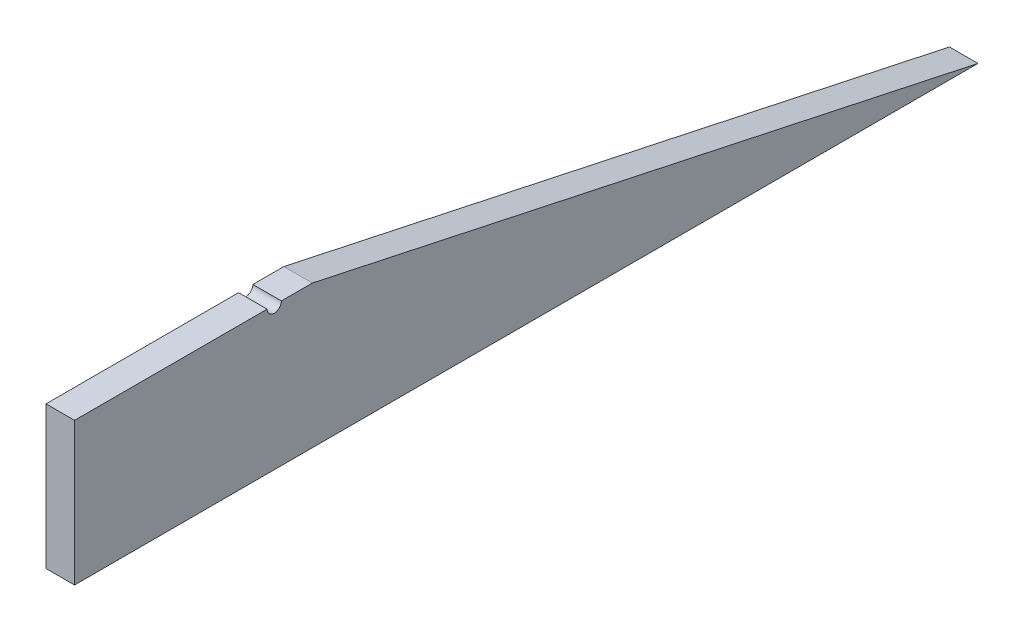
ISO-10303-21;
HEADER;
FILE_DESCRIPTION(('STEP AP214'),'2;1');
FILE_NAME('part.step','',(''),(''),'','','');
FILE_SCHEMA(('AUTOMOTIVE_DESIGN { 1 0 10303 214 1 1 1 1 }'));
ENDSEC;
DATA;
#1=APPLICATION_CONTEXT('core data for automotive mechanical design processes');
#2=APPLICATION_PROTOCOL_DEFINITION('international standard','automotive_design',2000,#1);
#3=PRODUCT_CONTEXT('',#1,'mechanical');
#4=PRODUCT('Part','Part','',(#3));
#5=PRODUCT_RELATED_PRODUCT_CATEGORY('part','',(#4));
#6=PRODUCT_DEFINITION_FORMATION('','',#4);
#7=PRODUCT_DEFINITION_CONTEXT('part definition',#1,'design');
#8=PRODUCT_DEFINITION('design','',#6,#7);
#9=PRODUCT_DEFINITION_SHAPE('','',#8);
#10=(LENGTH_UNIT() NAMED_UNIT(*) SI_UNIT(.MILLI.,.METRE.));
#11=(NAMED_UNIT(*) PLANE_ANGLE_UNIT() SI_UNIT($,.RADIAN.));
#12=(NAMED_UNIT(*) SI_UNIT($,.STERADIAN.) SOLID_ANGLE_UNIT());
#13=UNCERTAINTY_MEASURE_WITH_UNIT(LENGTH_MEASURE(1.E-05),#10,'distance_accuracy_value','');
#14=(GEOMETRIC_REPRESENTATION_CONTEXT(3) GLOBAL_UNCERTAINTY_ASSIGNED_CONTEXT((#13)) GLOBAL_UNIT_ASSIGNED_CONTEXT((#10,
#11,#12)) REPRESENTATION_CONTEXT('',''));
#15=CARTESIAN_POINT('',(0.,0.,0.));
#16=DIRECTION('',(0.,0.,1.));
#17=DIRECTION('',(1.,0.,0.));
#18=AXIS2_PLACEMENT_3D('',#15,#16,#17);
#19=CARTESIAN_POINT('',(-0.01,-0.00209529088739757,-800.009778024141));
#20=DIRECTION('',(0.,0.97780241407741,-0.209529088730873));
#21=DIRECTION('',(0.,0.209529088730873,0.97780241407741));
#22=AXIS2_PLACEMENT_3D('',#19,#20,#21);
#23=PLANE('',#22);
#24=DIRECTION('',(0.,0.209529088730874,0.97780241407741));
#25=VECTOR('',#24,1.);
#26=CARTESIAN_POINT('',(30.,0.,-800.));
#27=LINE('',#26,#25);
#28=CARTESIAN_POINT('',(30.,0.,-800.));
#29=VERTEX_POINT('',#28);
#30=CARTESIAN_POINT('',(30.,150.,-99.9999999999995));
#31=VERTEX_POINT('',#30);
#32=EDGE_CURVE('E21',#29,#31,#27,.T.);
#33=ORIENTED_EDGE('',*,*,#32,.F.);
#34=DIRECTION('',(1.,0.,0.));
#35=VECTOR('',#34,1.);
#36=CARTESIAN_POINT('',(15.,0.,-800.));
#37=LINE('',#36,#35);
#38=CARTESIAN_POINT('',(0.,0.,-800.000000000001));
#39=VERTEX_POINT('',#38);
#40=EDGE_CURVE('E61',#39,#29,#37,.T.);
#41=ORIENTED_EDGE('',*,*,#40,.F.);
#42=DIRECTION('',(0.,-0.209529088730874,-0.97780241407741));
#43=VECTOR('',#42,1.);
#44=CARTESIAN_POINT('',(0.,150.,-100.));
#45=LINE('',#44,#43);
#46=CARTESIAN_POINT('',(0.,150.,-100.));
#47=VERTEX_POINT('',#46);
#48=EDGE_CURVE('E110',#47,#39,#45,.T.);
#49=ORIENTED_EDGE('',*,*,#48,.F.);
#50=DIRECTION('',(-1.,0.,0.));
#51=VECTOR('',#50,1.);
#52=CARTESIAN_POINT('',(15.,150.,-100.));
#53=LINE('',#52,#51);
#54=EDGE_CURVE('E114',#31,#47,#53,.T.);
#55=ORIENTED_EDGE('',*,*,#54,.F.);
#56=EDGE_LOOP('',(#33,#41,#49,#55));
#57=FACE_BOUND('',#56,.T.);
#58=ADVANCED_FACE('F17',(#57),#23,.T.);
#59=CARTESIAN_POINT('',(-0.01,0.,150.01));
#60=DIRECTION('',(0.,-1.,0.));
#61=DIRECTION('',(0.,0.,-1.));
#62=AXIS2_PLACEMENT_3D('',#59,#60,#61);
#63=PLANE('',#62);
#64=DIRECTION('',(0.,0.,-1.));
#65=VECTOR('',#64,1.);
#66=CARTESIAN_POINT('',(30.,0.,-325.));
#67=LINE('',#66,#65);
#68=CARTESIAN_POINT('',(30.,0.,150.));
#69=VERTEX_POINT('',#68);
#70=EDGE_CURVE('E85',#69,#29,#67,.T.);
#71=ORIENTED_EDGE('',*,*,#70,.F.);
#72=DIRECTION('',(1.,0.,0.));
#73=VECTOR('',#72,1.);
#74=CARTESIAN_POINT('',(15.,0.,150.));
#75=LINE('',#74,#73);
#76=CARTESIAN_POINT('',(0.,0.,150.));
#77=VERTEX_POINT('',#76);
#78=EDGE_CURVE('E70',#77,#69,#75,.T.);
#79=ORIENTED_EDGE('',*,*,#78,.F.);
#80=DIRECTION('',(0.,0.,1.));
#81=VECTOR('',#80,1.);
#82=CARTESIAN_POINT('',(0.,0.,-325.));
#83=LINE('',#82,#81);
#84=EDGE_CURVE('E103',#39,#77,#83,.T.);
#85=ORIENTED_EDGE('',*,*,#84,.F.);
#86=ORIENTED_EDGE('',*,*,#40,.T.);
#87=EDGE_LOOP('',(#71,#79,#85,#86));
#88=FACE_BOUND('',#87,.T.);
#89=ADVANCED_FACE('F159',(#88),#63,.T.);
#90=CARTESIAN_POINT('',(-0.01,150.01,150.));
#91=DIRECTION('',(0.,0.,1.));
#92=DIRECTION('',(0.,-1.,0.));
#93=AXIS2_PLACEMENT_3D('',#90,#91,#92);
#94=PLANE('',#93);
#95=DIRECTION('',(0.,-1.,0.));
#96=VECTOR('',#95,1.);
#97=CARTESIAN_POINT('',(30.,75.,150.));
#98=LINE('',#97,#96);
#99=CARTESIAN_POINT('',(30.,150.,150.));
#100=VERTEX_POINT('',#99);
#101=EDGE_CURVE('E78',#100,#69,#98,.T.);
#102=ORIENTED_EDGE('',*,*,#101,.F.);
#103=DIRECTION('',(1.,0.,0.));
#104=VECTOR('',#103,1.);
#105=CARTESIAN_POINT('',(15.,150.,150.));
#106=LINE('',#105,#104);
#107=CARTESIAN_POINT('',(0.,150.,150.));
#108=VERTEX_POINT('',#107);
#109=EDGE_CURVE('E82',#108,#100,#106,.T.);
#110=ORIENTED_EDGE('',*,*,#109,.F.);
#111=DIRECTION('',(0.,1.,0.));
#112=VECTOR('',#111,1.);
#113=CARTESIAN_POINT('',(0.,75.,150.));
#114=LINE('',#113,#112);
#115=EDGE_CURVE('E75',#77,#108,#114,.T.);
#116=ORIENTED_EDGE('',*,*,#115,.F.);
#117=ORIENTED_EDGE('',*,*,#78,.T.);
#118=EDGE_LOOP('',(#102,#110,#116,#117));
#119=FACE_BOUND('',#118,.T.);
#120=ADVANCED_FACE('F80',(#119),#94,.T.);
#121=CARTESIAN_POINT('',(30.,-0.0100000000000922,150.01));
#122=DIRECTION('',(1.,0.,0.));
#123=DIRECTION('',(0.,0.,-1.));
#124=AXIS2_PLACEMENT_3D('',#121,#122,#123);
#125=PLANE('',#124);
#126=ORIENTED_EDGE('',*,*,#32,.T.);
#127=DIRECTION('',(0.,0.,-1.));
#128=VECTOR('',#127,1.);
#129=CARTESIAN_POINT('',(30.,150.,-83.75));
#130=LINE('',#129,#128);
#131=CARTESIAN_POINT('',(30.,150.,-67.5));
#132=VERTEX_POINT('',#131);
#133=EDGE_CURVE('E117',#132,#31,#130,.T.);
#134=ORIENTED_EDGE('',*,*,#133,.F.);
#135=CARTESIAN_POINT('',(30.,150.,-60.));
#136=DIRECTION('',(-1.,0.,0.));
#137=DIRECTION('',(0.,0.,1.));
#138=AXIS2_PLACEMENT_3D('',#135,#136,#137);
#139=CIRCLE('',#138,7.5);
#140=CARTESIAN_POINT('',(30.,150.,-52.5));
#141=VERTEX_POINT('',#140);
#142=EDGE_CURVE('E91',#141,#132,#139,.F.);
#143=ORIENTED_EDGE('',*,*,#142,.F.);
#144=DIRECTION('',(0.,0.,-1.));
#145=VECTOR('',#144,1.);
#146=CARTESIAN_POINT('',(30.,150.,48.75));
#147=LINE('',#146,#145);
#148=EDGE_CURVE('E88',#100,#141,#147,.T.);
#149=ORIENTED_EDGE('',*,*,#148,.F.);
#150=ORIENTED_EDGE('',*,*,#101,.T.);
#151=ORIENTED_EDGE('',*,*,#70,.T.);
#152=EDGE_LOOP('',(#126,#134,#143,#149,#150,#151));
#153=FACE_BOUND('',#152,.T.);
#154=ADVANCED_FACE('F89',(#153),#125,.T.);
#155=CARTESIAN_POINT('',(-0.01,150.,-100.01));
#156=DIRECTION('',(0.,1.,0.));
#157=DIRECTION('',(0.,0.,1.));
#158=AXIS2_PLACEMENT_3D('',#155,#156,#157);
#159=PLANE('',#158);
#160=ORIENTED_EDGE('',*,*,#54,.T.);
#161=DIRECTION('',(0.,0.,-1.));
#162=VECTOR('',#161,1.);
#163=CARTESIAN_POINT('',(0.,150.,-325.));
#164=LINE('',#163,#162);
#165=CARTESIAN_POINT('',(0.,150.,-67.5));
#166=VERTEX_POINT('',#165);
#167=EDGE_CURVE('E116',#166,#47,#164,.T.);
#168=ORIENTED_EDGE('',*,*,#167,.F.);
#169=DIRECTION('',(-1.,0.,0.));
#170=VECTOR('',#169,1.);
#171=CARTESIAN_POINT('',(15.,150.,-67.5));
#172=LINE('',#171,#170);
#173=EDGE_CURVE('E123',#132,#166,#172,.T.);
#174=ORIENTED_EDGE('',*,*,#173,.F.);
#175=ORIENTED_EDGE('',*,*,#133,.T.);
#176=EDGE_LOOP('',(#160,#168,#174,#175));
#177=FACE_BOUND('',#176,.T.);
#178=ADVANCED_FACE('F140',(#177),#159,.T.);
#179=CARTESIAN_POINT('',(0.,-0.0100000000000922,-800.01));
#180=DIRECTION('',(-1.,0.,0.));
#181=DIRECTION('',(0.,0.,1.));
#182=AXIS2_PLACEMENT_3D('',#179,#180,#181);
#183=PLANE('',#182);
#184=ORIENTED_EDGE('',*,*,#115,.T.);
#185=DIRECTION('',(0.,0.,1.));
#186=VECTOR('',#185,1.);
#187=CARTESIAN_POINT('',(0.,150.,48.75));
#188=LINE('',#187,#186);
#189=CARTESIAN_POINT('',(0.,150.,-52.5));
#190=VERTEX_POINT('',#189);
#191=EDGE_CURVE('E36',#190,#108,#188,.T.);
#192=ORIENTED_EDGE('',*,*,#191,.F.);
#193=CARTESIAN_POINT('',(0.,150.,-60.));
#194=DIRECTION('',(-1.,0.,0.));
#195=DIRECTION('',(0.,0.,1.));
#196=AXIS2_PLACEMENT_3D('',#193,#194,#195);
#197=CIRCLE('',#196,7.5);
#198=EDGE_CURVE('E27',#166,#190,#197,.T.);
#199=ORIENTED_EDGE('',*,*,#198,.F.);
#200=ORIENTED_EDGE('',*,*,#167,.T.);
#201=ORIENTED_EDGE('',*,*,#48,.T.);
#202=ORIENTED_EDGE('',*,*,#84,.T.);
#203=EDGE_LOOP('',(#184,#192,#199,#200,#201,#202));
#204=FACE_BOUND('',#203,.T.);
#205=ADVANCED_FACE('F141',(#204),#183,.T.);
#206=CARTESIAN_POINT('',(-0.01,150.,-52.51));
#207=DIRECTION('',(0.,1.,0.));
#208=DIRECTION('',(0.,0.,1.));
#209=AXIS2_PLACEMENT_3D('',#206,#207,#208);
#210=PLANE('',#209);
#211=ORIENTED_EDGE('',*,*,#109,.T.);
#212=ORIENTED_EDGE('',*,*,#148,.T.);
#213=DIRECTION('',(1.,0.,0.));
#214=VECTOR('',#213,1.);
#215=CARTESIAN_POINT('',(15.,150.,-52.5));
#216=LINE('',#215,#214);
#217=EDGE_CURVE('E11',#190,#141,#216,.T.);
#218=ORIENTED_EDGE('',*,*,#217,.F.);
#219=ORIENTED_EDGE('',*,*,#191,.T.);
#220=EDGE_LOOP('',(#211,#212,#218,#219));
#221=FACE_BOUND('',#220,.T.);
#222=ADVANCED_FACE('F94',(#221),#210,.T.);
#223=CARTESIAN_POINT('',(30.,150.,-60.));
#224=DIRECTION('',(-1.,0.,0.));
#225=DIRECTION('',(0.,0.,1.));
#226=AXIS2_PLACEMENT_3D('',#223,#224,#225);
#227=CYLINDRICAL_SURFACE('',#226,7.5);
#228=ORIENTED_EDGE('',*,*,#198,.T.);
#229=ORIENTED_EDGE('',*,*,#217,.T.);
#230=ORIENTED_EDGE('',*,*,#142,.T.);
#231=ORIENTED_EDGE('',*,*,#173,.T.);
#232=EDGE_LOOP('',(#228,#229,#230,#231));
#233=FACE_BOUND('',#232,.T.);
#234=ADVANCED_FACE('F19',(#233),#227,.F.);
#235=CLOSED_SHELL('',(#58,#89,#120,#154,#178,#205,#222,#234));
#236=MANIFOLD_SOLID_BREP('B1',#235);
#237=ADVANCED_BREP_SHAPE_REPRESENTATION('',(#18,#236),#14);
#238=SHAPE_DEFINITION_REPRESENTATION(#9,#237);
ENDSEC;
END-ISO-10303-21;
